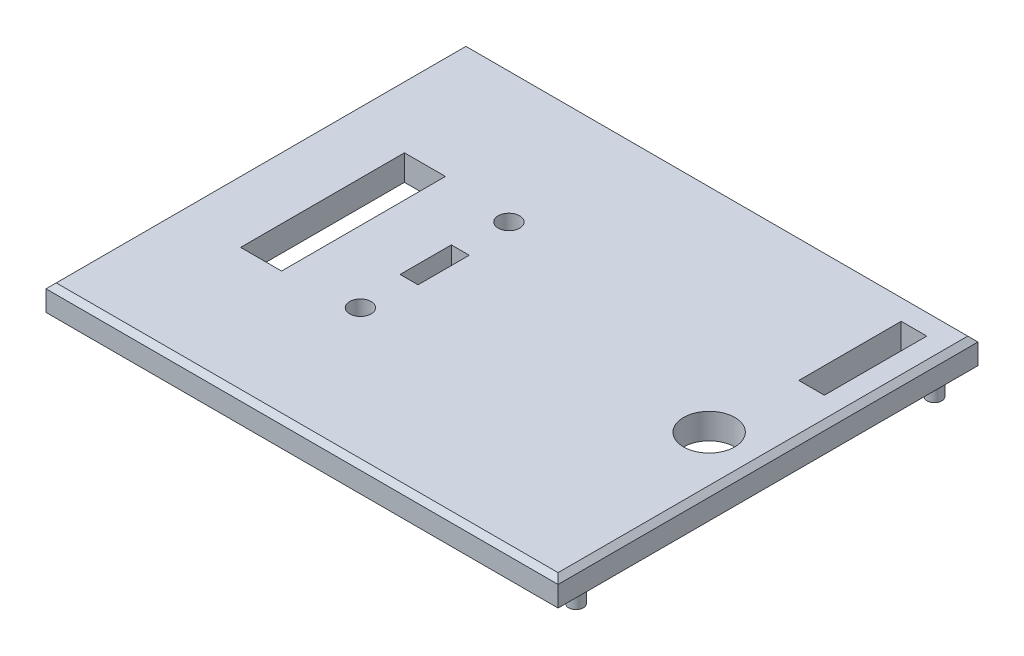
ISO-10303-21;
HEADER;
FILE_DESCRIPTION(('STEP AP214'),'2;1');
FILE_NAME('part.step','',(''),(''),'','','');
FILE_SCHEMA(('AUTOMOTIVE_DESIGN { 1 0 10303 214 1 1 1 1 }'));
ENDSEC;
DATA;
#1=APPLICATION_CONTEXT('core data for automotive mechanical design processes');
#2=APPLICATION_PROTOCOL_DEFINITION('international standard','automotive_design',2000,#1);
#3=PRODUCT_CONTEXT('',#1,'mechanical');
#4=PRODUCT('Part','Part','',(#3));
#5=PRODUCT_RELATED_PRODUCT_CATEGORY('part','',(#4));
#6=PRODUCT_DEFINITION_FORMATION('','',#4);
#7=PRODUCT_DEFINITION_CONTEXT('part definition',#1,'design');
#8=PRODUCT_DEFINITION('design','',#6,#7);
#9=PRODUCT_DEFINITION_SHAPE('','',#8);
#10=(LENGTH_UNIT() NAMED_UNIT(*) SI_UNIT(.MILLI.,.METRE.));
#11=(NAMED_UNIT(*) PLANE_ANGLE_UNIT() SI_UNIT($,.RADIAN.));
#12=(NAMED_UNIT(*) SI_UNIT($,.STERADIAN.) SOLID_ANGLE_UNIT());
#13=UNCERTAINTY_MEASURE_WITH_UNIT(LENGTH_MEASURE(1.E-05),#10,'distance_accuracy_value','');
#14=(GEOMETRIC_REPRESENTATION_CONTEXT(3) GLOBAL_UNCERTAINTY_ASSIGNED_CONTEXT((#13)) GLOBAL_UNIT_ASSIGNED_CONTEXT((#10,
#11,#12)) REPRESENTATION_CONTEXT('',''));
#15=CARTESIAN_POINT('',(0.,0.,0.));
#16=DIRECTION('',(0.,0.,1.));
#17=DIRECTION('',(1.,0.,0.));
#18=AXIS2_PLACEMENT_3D('',#15,#16,#17);
#19=CARTESIAN_POINT('',(0.,5.,5.));
#20=DIRECTION('',(0.,0.,1.));
#21=DIRECTION('',(1.,0.,0.));
#22=AXIS2_PLACEMENT_3D('',#19,#20,#21);
#23=PLANE('',#22);
#24=DIRECTION('',(-1.,0.,0.));
#25=VECTOR('',#24,1.);
#26=CARTESIAN_POINT('',(0.,0.,5.));
#27=LINE('',#26,#25);
#28=CARTESIAN_POINT('',(-13.35,0.,5.));
#29=VERTEX_POINT('',#28);
#30=CARTESIAN_POINT('',(-16.85,0.,5.));
#31=VERTEX_POINT('',#30);
#32=EDGE_CURVE('E304',#29,#31,#27,.T.);
#33=ORIENTED_EDGE('',*,*,#32,.T.);
#34=DIRECTION('',(0.,-1.,0.));
#35=VECTOR('',#34,1.);
#36=CARTESIAN_POINT('',(-16.85,5.,5.));
#37=LINE('',#36,#35);
#38=CARTESIAN_POINT('',(-16.85,5.,5.));
#39=VERTEX_POINT('',#38);
#40=EDGE_CURVE('E331',#39,#31,#37,.T.);
#41=ORIENTED_EDGE('',*,*,#40,.F.);
#42=DIRECTION('',(-1.,0.,0.));
#43=VECTOR('',#42,1.);
#44=CARTESIAN_POINT('',(0.,5.,5.));
#45=LINE('',#44,#43);
#46=CARTESIAN_POINT('',(-13.35,5.,5.));
#47=VERTEX_POINT('',#46);
#48=EDGE_CURVE('E230',#47,#39,#45,.T.);
#49=ORIENTED_EDGE('',*,*,#48,.F.);
#50=DIRECTION('',(0.,-1.,0.));
#51=VECTOR('',#50,1.);
#52=CARTESIAN_POINT('',(-13.35,5.,5.));
#53=LINE('',#52,#51);
#54=EDGE_CURVE('E321',#47,#29,#53,.T.);
#55=ORIENTED_EDGE('',*,*,#54,.T.);
#56=EDGE_LOOP('',(#33,#41,#49,#55));
#57=FACE_BOUND('',#56,.T.);
#58=ADVANCED_FACE('F47',(#57),#23,.F.);
#59=CARTESIAN_POINT('',(-16.85,5.,0.));
#60=DIRECTION('',(-1.,0.,0.));
#61=DIRECTION('',(0.,0.,1.));
#62=AXIS2_PLACEMENT_3D('',#59,#60,#61);
#63=PLANE('',#62);
#64=DIRECTION('',(0.,0.,-1.));
#65=VECTOR('',#64,1.);
#66=CARTESIAN_POINT('',(-16.85,0.,0.));
#67=LINE('',#66,#65);
#68=CARTESIAN_POINT('',(-16.85,0.,-5.));
#69=VERTEX_POINT('',#68);
#70=EDGE_CURVE('E308',#31,#69,#67,.T.);
#71=ORIENTED_EDGE('',*,*,#70,.T.);
#72=DIRECTION('',(0.,-1.,0.));
#73=VECTOR('',#72,1.);
#74=CARTESIAN_POINT('',(-16.85,5.,-5.));
#75=LINE('',#74,#73);
#76=CARTESIAN_POINT('',(-16.85,5.,-5.));
#77=VERTEX_POINT('',#76);
#78=EDGE_CURVE('E328',#77,#69,#75,.T.);
#79=ORIENTED_EDGE('',*,*,#78,.F.);
#80=DIRECTION('',(0.,0.,-1.));
#81=VECTOR('',#80,1.);
#82=CARTESIAN_POINT('',(-16.85,5.,0.));
#83=LINE('',#82,#81);
#84=EDGE_CURVE('E234',#39,#77,#83,.T.);
#85=ORIENTED_EDGE('',*,*,#84,.F.);
#86=ORIENTED_EDGE('',*,*,#40,.T.);
#87=EDGE_LOOP('',(#71,#79,#85,#86));
#88=FACE_BOUND('',#87,.T.);
#89=ADVANCED_FACE('F445',(#88),#63,.F.);
#90=CARTESIAN_POINT('',(0.,5.,-5.));
#91=DIRECTION('',(0.,0.,1.));
#92=DIRECTION('',(1.,0.,0.));
#93=AXIS2_PLACEMENT_3D('',#90,#91,#92);
#94=PLANE('',#93);
#95=DIRECTION('',(-1.,0.,0.));
#96=VECTOR('',#95,1.);
#97=CARTESIAN_POINT('',(0.,0.,-5.));
#98=LINE('',#97,#96);
#99=CARTESIAN_POINT('',(-13.35,0.,-5.));
#100=VERTEX_POINT('',#99);
#101=EDGE_CURVE('E312',#100,#69,#98,.T.);
#102=ORIENTED_EDGE('',*,*,#101,.F.);
#103=DIRECTION('',(0.,-1.,0.));
#104=VECTOR('',#103,1.);
#105=CARTESIAN_POINT('',(-13.35,5.,-5.));
#106=LINE('',#105,#104);
#107=CARTESIAN_POINT('',(-13.35,5.,-5.));
#108=VERTEX_POINT('',#107);
#109=EDGE_CURVE('E324',#108,#100,#106,.T.);
#110=ORIENTED_EDGE('',*,*,#109,.F.);
#111=DIRECTION('',(-1.,0.,0.));
#112=VECTOR('',#111,1.);
#113=CARTESIAN_POINT('',(0.,5.,-5.));
#114=LINE('',#113,#112);
#115=EDGE_CURVE('E237',#108,#77,#114,.T.);
#116=ORIENTED_EDGE('',*,*,#115,.T.);
#117=ORIENTED_EDGE('',*,*,#78,.T.);
#118=EDGE_LOOP('',(#102,#110,#116,#117));
#119=FACE_BOUND('',#118,.T.);
#120=ADVANCED_FACE('F442',(#119),#94,.T.);
#121=CARTESIAN_POINT('',(45.,5.,0.));
#122=DIRECTION('',(-1.,0.,0.));
#123=DIRECTION('',(0.,0.,1.));
#124=AXIS2_PLACEMENT_3D('',#121,#122,#123);
#125=PLANE('',#124);
#126=DIRECTION('',(0.,0.,-1.));
#127=VECTOR('',#126,1.);
#128=CARTESIAN_POINT('',(45.,0.,0.));
#129=LINE('',#128,#127);
#130=CARTESIAN_POINT('',(45.,0.,-16.));
#131=VERTEX_POINT('',#130);
#132=CARTESIAN_POINT('',(45.,0.,-36.));
#133=VERTEX_POINT('',#132);
#134=EDGE_CURVE('E288',#131,#133,#129,.T.);
#135=ORIENTED_EDGE('',*,*,#134,.F.);
#136=DIRECTION('',(0.,-1.,0.));
#137=VECTOR('',#136,1.);
#138=CARTESIAN_POINT('',(45.,5.,-16.));
#139=LINE('',#138,#137);
#140=CARTESIAN_POINT('',(45.,5.,-16.));
#141=VERTEX_POINT('',#140);
#142=EDGE_CURVE('E325',#141,#131,#139,.T.);
#143=ORIENTED_EDGE('',*,*,#142,.F.);
#144=DIRECTION('',(0.,0.,-1.));
#145=VECTOR('',#144,1.);
#146=CARTESIAN_POINT('',(45.,5.,0.));
#147=LINE('',#146,#145);
#148=CARTESIAN_POINT('',(45.,5.,-36.));
#149=VERTEX_POINT('',#148);
#150=EDGE_CURVE('E216',#141,#149,#147,.T.);
#151=ORIENTED_EDGE('',*,*,#150,.T.);
#152=DIRECTION('',(0.,-1.,0.));
#153=VECTOR('',#152,1.);
#154=CARTESIAN_POINT('',(45.,5.,-36.));
#155=LINE('',#154,#153);
#156=EDGE_CURVE('E336',#149,#133,#155,.T.);
#157=ORIENTED_EDGE('',*,*,#156,.T.);
#158=EDGE_LOOP('',(#135,#143,#151,#157));
#159=FACE_BOUND('',#158,.T.);
#160=ADVANCED_FACE('F479',(#159),#125,.T.);
#161=CARTESIAN_POINT('',(0.,5.,-16.));
#162=DIRECTION('',(0.,0.,1.));
#163=DIRECTION('',(1.,0.,0.));
#164=AXIS2_PLACEMENT_3D('',#161,#162,#163);
#165=PLANE('',#164);
#166=DIRECTION('',(-1.,0.,0.));
#167=VECTOR('',#166,1.);
#168=CARTESIAN_POINT('',(0.,0.,-16.));
#169=LINE('',#168,#167);
#170=CARTESIAN_POINT('',(40.,0.,-16.));
#171=VERTEX_POINT('',#170);
#172=EDGE_CURVE('E292',#131,#171,#169,.T.);
#173=ORIENTED_EDGE('',*,*,#172,.T.);
#174=DIRECTION('',(0.,-1.,0.));
#175=VECTOR('',#174,1.);
#176=CARTESIAN_POINT('',(40.,5.,-16.));
#177=LINE('',#176,#175);
#178=CARTESIAN_POINT('',(40.,5.,-16.));
#179=VERTEX_POINT('',#178);
#180=EDGE_CURVE('E343',#179,#171,#177,.T.);
#181=ORIENTED_EDGE('',*,*,#180,.F.);
#182=DIRECTION('',(-1.,0.,0.));
#183=VECTOR('',#182,1.);
#184=CARTESIAN_POINT('',(0.,5.,-16.));
#185=LINE('',#184,#183);
#186=EDGE_CURVE('E220',#141,#179,#185,.T.);
#187=ORIENTED_EDGE('',*,*,#186,.F.);
#188=ORIENTED_EDGE('',*,*,#142,.T.);
#189=EDGE_LOOP('',(#173,#181,#187,#188));
#190=FACE_BOUND('',#189,.T.);
#191=ADVANCED_FACE('F475',(#190),#165,.F.);
#192=CARTESIAN_POINT('',(40.,5.,0.));
#193=DIRECTION('',(1.,0.,0.));
#194=DIRECTION('',(0.,0.,-1.));
#195=AXIS2_PLACEMENT_3D('',#192,#193,#194);
#196=PLANE('',#195);
#197=DIRECTION('',(0.,0.,1.));
#198=VECTOR('',#197,1.);
#199=CARTESIAN_POINT('',(40.,0.,0.));
#200=LINE('',#199,#198);
#201=CARTESIAN_POINT('',(40.,0.,-36.));
#202=VERTEX_POINT('',#201);
#203=EDGE_CURVE('E296',#202,#171,#200,.T.);
#204=ORIENTED_EDGE('',*,*,#203,.F.);
#205=DIRECTION('',(0.,-1.,0.));
#206=VECTOR('',#205,1.);
#207=CARTESIAN_POINT('',(40.,5.,-36.));
#208=LINE('',#207,#206);
#209=CARTESIAN_POINT('',(40.,5.,-36.));
#210=VERTEX_POINT('',#209);
#211=EDGE_CURVE('E339',#210,#202,#208,.T.);
#212=ORIENTED_EDGE('',*,*,#211,.F.);
#213=DIRECTION('',(0.,0.,1.));
#214=VECTOR('',#213,1.);
#215=CARTESIAN_POINT('',(40.,5.,0.));
#216=LINE('',#215,#214);
#217=EDGE_CURVE('E223',#210,#179,#216,.T.);
#218=ORIENTED_EDGE('',*,*,#217,.T.);
#219=ORIENTED_EDGE('',*,*,#180,.T.);
#220=EDGE_LOOP('',(#204,#212,#218,#219));
#221=FACE_BOUND('',#220,.T.);
#222=ADVANCED_FACE('F471',(#221),#196,.T.);
#223=CARTESIAN_POINT('',(50.,5.,0.));
#224=DIRECTION('',(1.,0.,0.));
#225=DIRECTION('',(0.,0.,-1.));
#226=AXIS2_PLACEMENT_3D('',#223,#224,#225);
#227=PLANE('',#226);
#228=DIRECTION('',(0.,-1.,0.));
#229=VECTOR('',#228,1.);
#230=CARTESIAN_POINT('',(50.,5.,-41.));
#231=LINE('',#230,#229);
#232=CARTESIAN_POINT('',(50.,3.99999999999999,-41.));
#233=VERTEX_POINT('',#232);
#234=CARTESIAN_POINT('',(50.,0.,-41.));
#235=VERTEX_POINT('',#234);
#236=EDGE_CURVE('E340',#233,#235,#231,.T.);
#237=ORIENTED_EDGE('',*,*,#236,.F.);
#238=DIRECTION('',(0.,0.,1.));
#239=VECTOR('',#238,1.);
#240=CARTESIAN_POINT('',(50.,3.99999999999999,0.));
#241=LINE('',#240,#239);
#242=CARTESIAN_POINT('',(50.,3.99999999999999,41.));
#243=VERTEX_POINT('',#242);
#244=EDGE_CURVE('E64',#233,#243,#241,.T.);
#245=ORIENTED_EDGE('',*,*,#244,.T.);
#246=DIRECTION('',(0.,-1.,0.));
#247=VECTOR('',#246,1.);
#248=CARTESIAN_POINT('',(50.,5.,41.));
#249=LINE('',#248,#247);
#250=CARTESIAN_POINT('',(50.,0.,41.));
#251=VERTEX_POINT('',#250);
#252=EDGE_CURVE('E186',#243,#251,#249,.T.);
#253=ORIENTED_EDGE('',*,*,#252,.T.);
#254=DIRECTION('',(0.,0.,1.));
#255=VECTOR('',#254,1.);
#256=CARTESIAN_POINT('',(50.,0.,0.));
#257=LINE('',#256,#255);
#258=EDGE_CURVE('E272',#235,#251,#257,.T.);
#259=ORIENTED_EDGE('',*,*,#258,.F.);
#260=EDGE_LOOP('',(#237,#245,#253,#259));
#261=FACE_BOUND('',#260,.T.);
#262=ADVANCED_FACE('F474',(#261),#227,.T.);
#263=CARTESIAN_POINT('',(0.,5.,-41.));
#264=DIRECTION('',(0.,0.,-1.));
#265=DIRECTION('',(-1.,0.,0.));
#266=AXIS2_PLACEMENT_3D('',#263,#264,#265);
#267=PLANE('',#266);
#268=DIRECTION('',(0.,-1.,0.));
#269=VECTOR('',#268,1.);
#270=CARTESIAN_POINT('',(-50.,5.,-41.));
#271=LINE('',#270,#269);
#272=CARTESIAN_POINT('',(-50.,3.99999999999999,-41.));
#273=VERTEX_POINT('',#272);
#274=CARTESIAN_POINT('',(-50.,0.,-41.));
#275=VERTEX_POINT('',#274);
#276=EDGE_CURVE('E353',#273,#275,#271,.T.);
#277=ORIENTED_EDGE('',*,*,#276,.F.);
#278=DIRECTION('',(1.,0.,0.));
#279=VECTOR('',#278,1.);
#280=CARTESIAN_POINT('',(0.,3.99999999999999,-41.));
#281=LINE('',#280,#279);
#282=EDGE_CURVE('E335',#273,#233,#281,.T.);
#283=ORIENTED_EDGE('',*,*,#282,.T.);
#284=ORIENTED_EDGE('',*,*,#236,.T.);
#285=DIRECTION('',(1.,0.,0.));
#286=VECTOR('',#285,1.);
#287=CARTESIAN_POINT('',(0.,0.,-41.));
#288=LINE('',#287,#286);
#289=EDGE_CURVE('E276',#275,#235,#288,.T.);
#290=ORIENTED_EDGE('',*,*,#289,.F.);
#291=EDGE_LOOP('',(#277,#283,#284,#290));
#292=FACE_BOUND('',#291,.T.);
#293=ADVANCED_FACE('F490',(#292),#267,.T.);
#294=CARTESIAN_POINT('',(-50.,5.,0.));
#295=DIRECTION('',(-1.,0.,0.));
#296=DIRECTION('',(0.,0.,1.));
#297=AXIS2_PLACEMENT_3D('',#294,#295,#296);
#298=PLANE('',#297);
#299=DIRECTION('',(0.,-1.,0.));
#300=VECTOR('',#299,1.);
#301=CARTESIAN_POINT('',(-50.,5.,41.));
#302=LINE('',#301,#300);
#303=CARTESIAN_POINT('',(-50.,3.99999999999999,41.));
#304=VERTEX_POINT('',#303);
#305=CARTESIAN_POINT('',(-50.,0.,41.));
#306=VERTEX_POINT('',#305);
#307=EDGE_CURVE('E350',#304,#306,#302,.T.);
#308=ORIENTED_EDGE('',*,*,#307,.F.);
#309=DIRECTION('',(0.,0.,-1.));
#310=VECTOR('',#309,1.);
#311=CARTESIAN_POINT('',(-50.,3.99999999999999,0.));
#312=LINE('',#311,#310);
#313=EDGE_CURVE('E382',#304,#273,#312,.T.);
#314=ORIENTED_EDGE('',*,*,#313,.T.);
#315=ORIENTED_EDGE('',*,*,#276,.T.);
#316=DIRECTION('',(0.,0.,-1.));
#317=VECTOR('',#316,1.);
#318=CARTESIAN_POINT('',(-50.,0.,0.));
#319=LINE('',#318,#317);
#320=EDGE_CURVE('E280',#306,#275,#319,.T.);
#321=ORIENTED_EDGE('',*,*,#320,.F.);
#322=EDGE_LOOP('',(#308,#314,#315,#321));
#323=FACE_BOUND('',#322,.T.);
#324=ADVANCED_FACE('F487',(#323),#298,.T.);
#325=CARTESIAN_POINT('',(0.,5.,16.));
#326=DIRECTION('',(0.,0.,-1.));
#327=DIRECTION('',(-1.,0.,0.));
#328=AXIS2_PLACEMENT_3D('',#325,#326,#327);
#329=PLANE('',#328);
#330=DIRECTION('',(1.,0.,0.));
#331=VECTOR('',#330,1.);
#332=CARTESIAN_POINT('',(0.,0.,16.));
#333=LINE('',#332,#331);
#334=CARTESIAN_POINT('',(-37.,0.,16.));
#335=VERTEX_POINT('',#334);
#336=CARTESIAN_POINT('',(-29.,0.,16.));
#337=VERTEX_POINT('',#336);
#338=EDGE_CURVE('E181',#335,#337,#333,.T.);
#339=ORIENTED_EDGE('',*,*,#338,.F.);
#340=DIRECTION('',(0.,-1.,0.));
#341=VECTOR('',#340,1.);
#342=CARTESIAN_POINT('',(-37.,5.,16.));
#343=LINE('',#342,#341);
#344=CARTESIAN_POINT('',(-37.,5.,16.));
#345=VERTEX_POINT('',#344);
#346=EDGE_CURVE('E175',#345,#335,#343,.T.);
#347=ORIENTED_EDGE('',*,*,#346,.F.);
#348=DIRECTION('',(1.,0.,0.));
#349=VECTOR('',#348,1.);
#350=CARTESIAN_POINT('',(0.,5.,16.));
#351=LINE('',#350,#349);
#352=CARTESIAN_POINT('',(-29.,5.,16.));
#353=VERTEX_POINT('',#352);
#354=EDGE_CURVE('E179',#345,#353,#351,.T.);
#355=ORIENTED_EDGE('',*,*,#354,.T.);
#356=DIRECTION('',(0.,-1.,0.));
#357=VECTOR('',#356,1.);
#358=CARTESIAN_POINT('',(-29.,5.,16.));
#359=LINE('',#358,#357);
#360=EDGE_CURVE('E245',#353,#337,#359,.T.);
#361=ORIENTED_EDGE('',*,*,#360,.T.);
#362=EDGE_LOOP('',(#339,#347,#355,#361));
#363=FACE_BOUND('',#362,.T.);
#364=ADVANCED_FACE('F177',(#363),#329,.T.);
#365=CARTESIAN_POINT('',(-37.,5.,0.));
#366=DIRECTION('',(-1.,0.,0.));
#367=DIRECTION('',(0.,0.,1.));
#368=AXIS2_PLACEMENT_3D('',#365,#366,#367);
#369=PLANE('',#368);
#370=DIRECTION('',(0.,0.,-1.));
#371=VECTOR('',#370,1.);
#372=CARTESIAN_POINT('',(-37.,0.,0.));
#373=LINE('',#372,#371);
#374=CARTESIAN_POINT('',(-37.,0.,-16.));
#375=VERTEX_POINT('',#374);
#376=EDGE_CURVE('E261',#335,#375,#373,.T.);
#377=ORIENTED_EDGE('',*,*,#376,.T.);
#378=DIRECTION('',(0.,-1.,0.));
#379=VECTOR('',#378,1.);
#380=CARTESIAN_POINT('',(-37.,5.,-16.));
#381=LINE('',#380,#379);
#382=CARTESIAN_POINT('',(-37.,5.,-16.));
#383=VERTEX_POINT('',#382);
#384=EDGE_CURVE('E187',#383,#375,#381,.T.);
#385=ORIENTED_EDGE('',*,*,#384,.F.);
#386=DIRECTION('',(0.,0.,-1.));
#387=VECTOR('',#386,1.);
#388=CARTESIAN_POINT('',(-37.,5.,0.));
#389=LINE('',#388,#387);
#390=EDGE_CURVE('E191',#345,#383,#389,.T.);
#391=ORIENTED_EDGE('',*,*,#390,.F.);
#392=ORIENTED_EDGE('',*,*,#346,.T.);
#393=EDGE_LOOP('',(#377,#385,#391,#392));
#394=FACE_BOUND('',#393,.T.);
#395=ADVANCED_FACE('F192',(#394),#369,.F.);
#396=CARTESIAN_POINT('',(0.,5.,-16.));
#397=DIRECTION('',(0.,0.,-1.));
#398=DIRECTION('',(-1.,0.,0.));
#399=AXIS2_PLACEMENT_3D('',#396,#397,#398);
#400=PLANE('',#399);
#401=DIRECTION('',(1.,0.,0.));
#402=VECTOR('',#401,1.);
#403=CARTESIAN_POINT('',(0.,0.,-16.));
#404=LINE('',#403,#402);
#405=CARTESIAN_POINT('',(-29.,0.,-16.));
#406=VERTEX_POINT('',#405);
#407=EDGE_CURVE('E264',#375,#406,#404,.T.);
#408=ORIENTED_EDGE('',*,*,#407,.T.);
#409=DIRECTION('',(0.,-1.,0.));
#410=VECTOR('',#409,1.);
#411=CARTESIAN_POINT('',(-29.,5.,-16.));
#412=LINE('',#411,#410);
#413=CARTESIAN_POINT('',(-29.,5.,-16.));
#414=VERTEX_POINT('',#413);
#415=EDGE_CURVE('E360',#414,#406,#412,.T.);
#416=ORIENTED_EDGE('',*,*,#415,.F.);
#417=DIRECTION('',(1.,0.,0.));
#418=VECTOR('',#417,1.);
#419=CARTESIAN_POINT('',(0.,5.,-16.));
#420=LINE('',#419,#418);
#421=EDGE_CURVE('E197',#383,#414,#420,.T.);
#422=ORIENTED_EDGE('',*,*,#421,.F.);
#423=ORIENTED_EDGE('',*,*,#384,.T.);
#424=EDGE_LOOP('',(#408,#416,#422,#423));
#425=FACE_BOUND('',#424,.T.);
#426=ADVANCED_FACE('F469',(#425),#400,.F.);
#427=CARTESIAN_POINT('',(0.,5.,-36.));
#428=DIRECTION('',(0.,0.,-1.));
#429=DIRECTION('',(-1.,0.,0.));
#430=AXIS2_PLACEMENT_3D('',#427,#428,#429);
#431=PLANE('',#430);
#432=DIRECTION('',(1.,0.,0.));
#433=VECTOR('',#432,1.);
#434=CARTESIAN_POINT('',(0.,0.,-36.));
#435=LINE('',#434,#433);
#436=EDGE_CURVE('E300',#202,#133,#435,.T.);
#437=ORIENTED_EDGE('',*,*,#436,.T.);
#438=ORIENTED_EDGE('',*,*,#156,.F.);
#439=DIRECTION('',(1.,0.,0.));
#440=VECTOR('',#439,1.);
#441=CARTESIAN_POINT('',(0.,5.,-36.));
#442=LINE('',#441,#440);
#443=EDGE_CURVE('E227',#210,#149,#442,.T.);
#444=ORIENTED_EDGE('',*,*,#443,.F.);
#445=ORIENTED_EDGE('',*,*,#211,.T.);
#446=EDGE_LOOP('',(#437,#438,#444,#445));
#447=FACE_BOUND('',#446,.T.);
#448=ADVANCED_FACE('F465',(#447),#431,.F.);
#449=CARTESIAN_POINT('',(0.,5.,41.));
#450=DIRECTION('',(0.,0.,-1.));
#451=DIRECTION('',(-1.,0.,0.));
#452=AXIS2_PLACEMENT_3D('',#449,#450,#451);
#453=PLANE('',#452);
#454=ORIENTED_EDGE('',*,*,#252,.F.);
#455=DIRECTION('',(-1.,0.,0.));
#456=VECTOR('',#455,1.);
#457=CARTESIAN_POINT('',(-50.,3.99999999999999,41.));
#458=LINE('',#457,#456);
#459=EDGE_CURVE('E71',#243,#304,#458,.T.);
#460=ORIENTED_EDGE('',*,*,#459,.T.);
#461=ORIENTED_EDGE('',*,*,#307,.T.);
#462=DIRECTION('',(1.,0.,0.));
#463=VECTOR('',#462,1.);
#464=CARTESIAN_POINT('',(0.,0.,41.));
#465=LINE('',#464,#463);
#466=EDGE_CURVE('E284',#306,#251,#465,.T.);
#467=ORIENTED_EDGE('',*,*,#466,.T.);
#468=EDGE_LOOP('',(#454,#460,#461,#467));
#469=FACE_BOUND('',#468,.T.);
#470=ADVANCED_FACE('F468',(#469),#453,.F.);
#471=CARTESIAN_POINT('',(-29.,5.,0.));
#472=DIRECTION('',(1.,0.,0.));
#473=DIRECTION('',(0.,0.,-1.));
#474=AXIS2_PLACEMENT_3D('',#471,#472,#473);
#475=PLANE('',#474);
#476=DIRECTION('',(0.,0.,1.));
#477=VECTOR('',#476,1.);
#478=CARTESIAN_POINT('',(-29.,0.,0.));
#479=LINE('',#478,#477);
#480=EDGE_CURVE('E268',#406,#337,#479,.T.);
#481=ORIENTED_EDGE('',*,*,#480,.T.);
#482=ORIENTED_EDGE('',*,*,#360,.F.);
#483=DIRECTION('',(0.,0.,1.));
#484=VECTOR('',#483,1.);
#485=CARTESIAN_POINT('',(-29.,5.,0.));
#486=LINE('',#485,#484);
#487=EDGE_CURVE('E201',#414,#353,#486,.T.);
#488=ORIENTED_EDGE('',*,*,#487,.F.);
#489=ORIENTED_EDGE('',*,*,#415,.T.);
#490=EDGE_LOOP('',(#481,#482,#488,#489));
#491=FACE_BOUND('',#490,.T.);
#492=ADVANCED_FACE('F486',(#491),#475,.F.);
#493=CARTESIAN_POINT('',(40.,5.,1.50000000000001));
#494=DIRECTION('',(0.,-1.,0.));
#495=DIRECTION('',(0.,0.,-1.));
#496=AXIS2_PLACEMENT_3D('',#493,#494,#495);
#497=CYLINDRICAL_SURFACE('',#496,5.);
#498=CARTESIAN_POINT('',(40.,5.,1.50000000000001));
#499=DIRECTION('',(0.,1.,0.));
#500=DIRECTION('',(0.,0.,1.));
#501=AXIS2_PLACEMENT_3D('',#498,#499,#500);
#502=CIRCLE('',#501,5.);
#503=CARTESIAN_POINT('',(40.,5.,6.50000000000001));
#504=VERTEX_POINT('',#503);
#505=EDGE_CURVE('E204',#504,#504,#502,.T.);
#506=ORIENTED_EDGE('',*,*,#505,.T.);
#507=EDGE_LOOP('',(#506));
#508=FACE_BOUND('',#507,.T.);
#509=CARTESIAN_POINT('',(40.,0.,1.50000000000001));
#510=DIRECTION('',(0.,1.,0.));
#511=DIRECTION('',(0.,0.,1.));
#512=AXIS2_PLACEMENT_3D('',#509,#510,#511);
#513=CIRCLE('',#512,5.);
#514=CARTESIAN_POINT('',(40.,0.,6.50000000000001));
#515=VERTEX_POINT('',#514);
#516=EDGE_CURVE('E255',#515,#515,#513,.T.);
#517=ORIENTED_EDGE('',*,*,#516,.F.);
#518=EDGE_LOOP('',(#517));
#519=FACE_BOUND('',#518,.T.);
#520=ADVANCED_FACE('F499',(#508,#519),#497,.F.);
#521=CARTESIAN_POINT('',(-15.1,5.,-14.5));
#522=DIRECTION('',(0.,-1.,0.));
#523=DIRECTION('',(0.,0.,-1.));
#524=AXIS2_PLACEMENT_3D('',#521,#522,#523);
#525=CYLINDRICAL_SURFACE('',#524,2.1);
#526=CARTESIAN_POINT('',(-15.1,5.,-14.5));
#527=DIRECTION('',(0.,1.,0.));
#528=DIRECTION('',(0.,0.,1.));
#529=AXIS2_PLACEMENT_3D('',#526,#527,#528);
#530=CIRCLE('',#529,2.1);
#531=CARTESIAN_POINT('',(-15.1,5.,-12.4));
#532=VERTEX_POINT('',#531);
#533=EDGE_CURVE('E208',#532,#532,#530,.T.);
#534=ORIENTED_EDGE('',*,*,#533,.T.);
#535=EDGE_LOOP('',(#534));
#536=FACE_BOUND('',#535,.T.);
#537=CARTESIAN_POINT('',(-15.1,0.,-14.5));
#538=DIRECTION('',(0.,1.,0.));
#539=DIRECTION('',(0.,0.,1.));
#540=AXIS2_PLACEMENT_3D('',#537,#538,#539);
#541=CIRCLE('',#540,2.1);
#542=CARTESIAN_POINT('',(-15.1,0.,-12.4));
#543=VERTEX_POINT('',#542);
#544=EDGE_CURVE('E250',#543,#543,#541,.T.);
#545=ORIENTED_EDGE('',*,*,#544,.F.);
#546=EDGE_LOOP('',(#545));
#547=FACE_BOUND('',#546,.T.);
#548=ADVANCED_FACE('F510',(#536,#547),#525,.F.);
#549=CARTESIAN_POINT('',(-15.1,5.,14.5));
#550=DIRECTION('',(0.,-1.,0.));
#551=DIRECTION('',(0.,0.,-1.));
#552=AXIS2_PLACEMENT_3D('',#549,#550,#551);
#553=CYLINDRICAL_SURFACE('',#552,2.1);
#554=CARTESIAN_POINT('',(-15.1,5.,14.5));
#555=DIRECTION('',(0.,1.,0.));
#556=DIRECTION('',(0.,0.,1.));
#557=AXIS2_PLACEMENT_3D('',#554,#555,#556);
#558=CIRCLE('',#557,2.1);
#559=CARTESIAN_POINT('',(-15.1,5.,16.6));
#560=VERTEX_POINT('',#559);
#561=EDGE_CURVE('E320',#560,#560,#558,.T.);
#562=ORIENTED_EDGE('',*,*,#561,.T.);
#563=EDGE_LOOP('',(#562));
#564=FACE_BOUND('',#563,.T.);
#565=CARTESIAN_POINT('',(-15.1,0.,14.5));
#566=DIRECTION('',(0.,1.,0.));
#567=DIRECTION('',(0.,0.,1.));
#568=AXIS2_PLACEMENT_3D('',#565,#566,#567);
#569=CIRCLE('',#568,2.1);
#570=CARTESIAN_POINT('',(-15.1,0.,16.6));
#571=VERTEX_POINT('',#570);
#572=EDGE_CURVE('E246',#571,#571,#569,.T.);
#573=ORIENTED_EDGE('',*,*,#572,.F.);
#574=EDGE_LOOP('',(#573));
#575=FACE_BOUND('',#574,.T.);
#576=ADVANCED_FACE('F453',(#564,#575),#553,.F.);
#577=CARTESIAN_POINT('',(-13.35,5.,0.));
#578=DIRECTION('',(-1.,0.,0.));
#579=DIRECTION('',(0.,0.,1.));
#580=AXIS2_PLACEMENT_3D('',#577,#578,#579);
#581=PLANE('',#580);
#582=DIRECTION('',(0.,0.,-1.));
#583=VECTOR('',#582,1.);
#584=CARTESIAN_POINT('',(-13.35,0.,0.));
#585=LINE('',#584,#583);
#586=EDGE_CURVE('E316',#29,#100,#585,.T.);
#587=ORIENTED_EDGE('',*,*,#586,.F.);
#588=ORIENTED_EDGE('',*,*,#54,.F.);
#589=DIRECTION('',(0.,0.,-1.));
#590=VECTOR('',#589,1.);
#591=CARTESIAN_POINT('',(-13.35,5.,0.));
#592=LINE('',#591,#590);
#593=EDGE_CURVE('E241',#47,#108,#592,.T.);
#594=ORIENTED_EDGE('',*,*,#593,.T.);
#595=ORIENTED_EDGE('',*,*,#109,.T.);
#596=EDGE_LOOP('',(#587,#588,#594,#595));
#597=FACE_BOUND('',#596,.T.);
#598=ADVANCED_FACE('F436',(#597),#581,.T.);
#599=CARTESIAN_POINT('',(0.,5.,0.));
#600=DIRECTION('',(0.,1.,0.));
#601=DIRECTION('',(0.,0.,1.));
#602=AXIS2_PLACEMENT_3D('',#599,#600,#601);
#603=PLANE('',#602);
#604=DIRECTION('',(0.,0.,-1.));
#605=VECTOR('',#604,1.);
#606=CARTESIAN_POINT('',(49.,5.,0.));
#607=LINE('',#606,#605);
#608=CARTESIAN_POINT('',(49.,5.,40.));
#609=VERTEX_POINT('',#608);
#610=CARTESIAN_POINT('',(49.,5.,-40.));
#611=VERTEX_POINT('',#610);
#612=EDGE_CURVE('E369',#609,#611,#607,.T.);
#613=ORIENTED_EDGE('',*,*,#612,.T.);
#614=DIRECTION('',(-1.,0.,0.));
#615=VECTOR('',#614,1.);
#616=CARTESIAN_POINT('',(0.,5.,-40.));
#617=LINE('',#616,#615);
#618=CARTESIAN_POINT('',(-49.,5.,-40.));
#619=VERTEX_POINT('',#618);
#620=EDGE_CURVE('E378',#611,#619,#617,.T.);
#621=ORIENTED_EDGE('',*,*,#620,.T.);
#622=DIRECTION('',(0.,0.,1.));
#623=VECTOR('',#622,1.);
#624=CARTESIAN_POINT('',(-49.,5.,0.));
#625=LINE('',#624,#623);
#626=CARTESIAN_POINT('',(-49.,5.,40.));
#627=VERTEX_POINT('',#626);
#628=EDGE_CURVE('E375',#619,#627,#625,.T.);
#629=ORIENTED_EDGE('',*,*,#628,.T.);
#630=DIRECTION('',(1.,0.,0.));
#631=VECTOR('',#630,1.);
#632=CARTESIAN_POINT('',(50.,5.,40.));
#633=LINE('',#632,#631);
#634=EDGE_CURVE('E372',#627,#609,#633,.T.);
#635=ORIENTED_EDGE('',*,*,#634,.T.);
#636=EDGE_LOOP('',(#613,#621,#629,#635));
#637=FACE_BOUND('',#636,.T.);
#638=ORIENTED_EDGE('',*,*,#561,.F.);
#639=EDGE_LOOP('',(#638));
#640=FACE_BOUND('',#639,.T.);
#641=ORIENTED_EDGE('',*,*,#533,.F.);
#642=EDGE_LOOP('',(#641));
#643=FACE_BOUND('',#642,.T.);
#644=ORIENTED_EDGE('',*,*,#505,.F.);
#645=EDGE_LOOP('',(#644));
#646=FACE_BOUND('',#645,.T.);
#647=ORIENTED_EDGE('',*,*,#354,.F.);
#648=ORIENTED_EDGE('',*,*,#390,.T.);
#649=ORIENTED_EDGE('',*,*,#421,.T.);
#650=ORIENTED_EDGE('',*,*,#487,.T.);
#651=EDGE_LOOP('',(#647,#648,#649,#650));
#652=FACE_BOUND('',#651,.T.);
#653=ORIENTED_EDGE('',*,*,#150,.F.);
#654=ORIENTED_EDGE('',*,*,#186,.T.);
#655=ORIENTED_EDGE('',*,*,#217,.F.);
#656=ORIENTED_EDGE('',*,*,#443,.T.);
#657=EDGE_LOOP('',(#653,#654,#655,#656));
#658=FACE_BOUND('',#657,.T.);
#659=ORIENTED_EDGE('',*,*,#48,.T.);
#660=ORIENTED_EDGE('',*,*,#84,.T.);
#661=ORIENTED_EDGE('',*,*,#115,.F.);
#662=ORIENTED_EDGE('',*,*,#593,.F.);
#663=EDGE_LOOP('',(#659,#660,#661,#662));
#664=FACE_BOUND('',#663,.T.);
#665=ADVANCED_FACE('F199',(#637,#640,#643,#646,#652,#658,#664),#603,.T.);
#666=CARTESIAN_POINT('',(0.,0.,0.));
#667=DIRECTION('',(0.,1.,0.));
#668=DIRECTION('',(0.,0.,1.));
#669=AXIS2_PLACEMENT_3D('',#666,#667,#668);
#670=PLANE('',#669);
#671=CARTESIAN_POINT('',(-47.5,0.,-35.));
#672=DIRECTION('',(0.,1.,0.));
#673=DIRECTION('',(0.,0.,1.));
#674=AXIS2_PLACEMENT_3D('',#671,#672,#673);
#675=CIRCLE('',#674,1.435);
#676=CARTESIAN_POINT('',(-47.5,0.,-33.565));
#677=VERTEX_POINT('',#676);
#678=EDGE_CURVE('E11',#677,#677,#675,.F.);
#679=ORIENTED_EDGE('',*,*,#678,.F.);
#680=EDGE_LOOP('',(#679));
#681=FACE_BOUND('',#680,.T.);
#682=CARTESIAN_POINT('',(47.5,0.,-35.));
#683=DIRECTION('',(0.,-1.,0.));
#684=DIRECTION('',(0.,0.,-1.));
#685=AXIS2_PLACEMENT_3D('',#682,#683,#684);
#686=CIRCLE('',#685,1.435);
#687=CARTESIAN_POINT('',(47.5,0.,-36.435));
#688=VERTEX_POINT('',#687);
#689=EDGE_CURVE('E853',#688,#688,#686,.F.);
#690=ORIENTED_EDGE('',*,*,#689,.T.);
#691=EDGE_LOOP('',(#690));
#692=FACE_BOUND('',#691,.T.);
#693=CARTESIAN_POINT('',(47.5,0.,35.));
#694=DIRECTION('',(0.,1.,0.));
#695=DIRECTION('',(0.,0.,1.));
#696=AXIS2_PLACEMENT_3D('',#693,#694,#695);
#697=CIRCLE('',#696,1.435);
#698=CARTESIAN_POINT('',(47.5,0.,36.435));
#699=VERTEX_POINT('',#698);
#700=EDGE_CURVE('E57',#699,#699,#697,.F.);
#701=ORIENTED_EDGE('',*,*,#700,.F.);
#702=EDGE_LOOP('',(#701));
#703=FACE_BOUND('',#702,.T.);
#704=CARTESIAN_POINT('',(-47.5,0.,35.));
#705=DIRECTION('',(0.,-1.,0.));
#706=DIRECTION('',(0.,0.,-1.));
#707=AXIS2_PLACEMENT_3D('',#704,#705,#706);
#708=CIRCLE('',#707,1.435);
#709=CARTESIAN_POINT('',(-47.5,0.,33.565));
#710=VERTEX_POINT('',#709);
#711=EDGE_CURVE('E416',#710,#710,#708,.F.);
#712=ORIENTED_EDGE('',*,*,#711,.T.);
#713=EDGE_LOOP('',(#712));
#714=FACE_BOUND('',#713,.T.);
#715=ORIENTED_EDGE('',*,*,#572,.T.);
#716=EDGE_LOOP('',(#715));
#717=FACE_BOUND('',#716,.T.);
#718=ORIENTED_EDGE('',*,*,#544,.T.);
#719=EDGE_LOOP('',(#718));
#720=FACE_BOUND('',#719,.T.);
#721=ORIENTED_EDGE('',*,*,#516,.T.);
#722=EDGE_LOOP('',(#721));
#723=FACE_BOUND('',#722,.T.);
#724=ORIENTED_EDGE('',*,*,#338,.T.);
#725=ORIENTED_EDGE('',*,*,#480,.F.);
#726=ORIENTED_EDGE('',*,*,#407,.F.);
#727=ORIENTED_EDGE('',*,*,#376,.F.);
#728=EDGE_LOOP('',(#724,#725,#726,#727));
#729=FACE_BOUND('',#728,.T.);
#730=ORIENTED_EDGE('',*,*,#258,.T.);
#731=ORIENTED_EDGE('',*,*,#466,.F.);
#732=ORIENTED_EDGE('',*,*,#320,.T.);
#733=ORIENTED_EDGE('',*,*,#289,.T.);
#734=EDGE_LOOP('',(#730,#731,#732,#733));
#735=FACE_BOUND('',#734,.T.);
#736=ORIENTED_EDGE('',*,*,#134,.T.);
#737=ORIENTED_EDGE('',*,*,#436,.F.);
#738=ORIENTED_EDGE('',*,*,#203,.T.);
#739=ORIENTED_EDGE('',*,*,#172,.F.);
#740=EDGE_LOOP('',(#736,#737,#738,#739));
#741=FACE_BOUND('',#740,.T.);
#742=ORIENTED_EDGE('',*,*,#32,.F.);
#743=ORIENTED_EDGE('',*,*,#586,.T.);
#744=ORIENTED_EDGE('',*,*,#101,.T.);
#745=ORIENTED_EDGE('',*,*,#70,.F.);
#746=EDGE_LOOP('',(#742,#743,#744,#745));
#747=FACE_BOUND('',#746,.T.);
#748=ADVANCED_FACE('F408',(#681,#692,#703,#714,#717,#720,#723,#729,#735,#741,#747),#670,.F.);
#749=CARTESIAN_POINT('',(0.,5.,40.));
#750=DIRECTION('',(0.,0.707106781186547,0.707106781186547));
#751=DIRECTION('',(-1.,0.,0.));
#752=AXIS2_PLACEMENT_3D('',#749,#750,#751);
#753=PLANE('',#752);
#754=DIRECTION('',(-0.577350269189626,0.577350269189626,-0.577350269189626));
#755=VECTOR('',#754,1.);
#756=CARTESIAN_POINT('',(36.3333333333334,17.6666666666667,27.3333333333333));
#757=LINE('',#756,#755);
#758=EDGE_CURVE('E396',#609,#243,#757,.F.);
#759=ORIENTED_EDGE('',*,*,#758,.F.);
#760=ORIENTED_EDGE('',*,*,#634,.F.);
#761=DIRECTION('',(0.577350269189626,0.577350269189626,-0.577350269189626));
#762=VECTOR('',#761,1.);
#763=CARTESIAN_POINT('',(-32.6666666666667,21.3333333333333,23.6666666666667));
#764=LINE('',#763,#762);
#765=EDGE_CURVE('E251',#304,#627,#764,.T.);
#766=ORIENTED_EDGE('',*,*,#765,.F.);
#767=ORIENTED_EDGE('',*,*,#459,.F.);
#768=EDGE_LOOP('',(#759,#760,#766,#767));
#769=FACE_BOUND('',#768,.T.);
#770=ADVANCED_FACE('F50',(#769),#753,.T.);
#771=CARTESIAN_POINT('',(-50.,3.99999999999999,0.));
#772=DIRECTION('',(0.707106781186547,-0.707106781186547,0.));
#773=DIRECTION('',(0.,0.,-1.));
#774=AXIS2_PLACEMENT_3D('',#771,#772,#773);
#775=PLANE('',#774);
#776=ORIENTED_EDGE('',*,*,#765,.T.);
#777=ORIENTED_EDGE('',*,*,#628,.F.);
#778=DIRECTION('',(-0.577350269189626,-0.577350269189626,-0.577350269189626));
#779=VECTOR('',#778,1.);
#780=CARTESIAN_POINT('',(-36.3333333333333,17.6666666666666,-27.3333333333333));
#781=LINE('',#780,#779);
#782=EDGE_CURVE('E392',#273,#619,#781,.F.);
#783=ORIENTED_EDGE('',*,*,#782,.F.);
#784=ORIENTED_EDGE('',*,*,#313,.F.);
#785=EDGE_LOOP('',(#776,#777,#783,#784));
#786=FACE_BOUND('',#785,.T.);
#787=ADVANCED_FACE('F532',(#786),#775,.F.);
#788=CARTESIAN_POINT('',(50.,3.99999999999999,0.));
#789=DIRECTION('',(-0.707106781186547,-0.707106781186547,0.));
#790=DIRECTION('',(0.,0.,1.));
#791=AXIS2_PLACEMENT_3D('',#788,#789,#790);
#792=PLANE('',#791);
#793=ORIENTED_EDGE('',*,*,#758,.T.);
#794=ORIENTED_EDGE('',*,*,#244,.F.);
#795=DIRECTION('',(-0.577350269189626,0.577350269189626,0.577350269189626));
#796=VECTOR('',#795,1.);
#797=CARTESIAN_POINT('',(36.3333333333334,17.6666666666666,-27.3333333333333));
#798=LINE('',#797,#796);
#799=EDGE_CURVE('E389',#611,#233,#798,.F.);
#800=ORIENTED_EDGE('',*,*,#799,.F.);
#801=ORIENTED_EDGE('',*,*,#612,.F.);
#802=EDGE_LOOP('',(#793,#794,#800,#801));
#803=FACE_BOUND('',#802,.T.);
#804=ADVANCED_FACE('F526',(#803),#792,.F.);
#805=CARTESIAN_POINT('',(0.,3.99999999999999,-41.));
#806=DIRECTION('',(0.,-0.707106781186547,0.707106781186547));
#807=DIRECTION('',(1.,0.,0.));
#808=AXIS2_PLACEMENT_3D('',#805,#806,#807);
#809=PLANE('',#808);
#810=ORIENTED_EDGE('',*,*,#782,.T.);
#811=ORIENTED_EDGE('',*,*,#620,.F.);
#812=ORIENTED_EDGE('',*,*,#799,.T.);
#813=ORIENTED_EDGE('',*,*,#282,.F.);
#814=EDGE_LOOP('',(#810,#811,#812,#813));
#815=FACE_BOUND('',#814,.T.);
#816=ADVANCED_FACE('F519',(#815),#809,.F.);
#817=CARTESIAN_POINT('',(-47.5,-3.5,35.));
#818=DIRECTION('',(0.,1.,0.));
#819=DIRECTION('',(0.,0.,1.));
#820=AXIS2_PLACEMENT_3D('',#817,#818,#819);
#821=CYLINDRICAL_SURFACE('',#820,1.435);
#822=CARTESIAN_POINT('',(-47.5,-3.5,35.));
#823=DIRECTION('',(0.,-1.,0.));
#824=DIRECTION('',(0.,0.,-1.));
#825=AXIS2_PLACEMENT_3D('',#822,#823,#824);
#826=CIRCLE('',#825,1.435);
#827=CARTESIAN_POINT('',(-47.5,-3.5,33.565));
#828=VERTEX_POINT('',#827);
#829=EDGE_CURVE('E393',#828,#828,#826,.F.);
#830=ORIENTED_EDGE('',*,*,#829,.T.);
#831=EDGE_LOOP('',(#830));
#832=FACE_BOUND('',#831,.T.);
#833=ORIENTED_EDGE('',*,*,#711,.F.);
#834=EDGE_LOOP('',(#833));
#835=FACE_BOUND('',#834,.T.);
#836=ADVANCED_FACE('F525',(#832,#835),#821,.T.);
#837=CARTESIAN_POINT('',(0.,-3.5,0.));
#838=DIRECTION('',(0.,-1.,0.));
#839=DIRECTION('',(0.,0.,-1.));
#840=AXIS2_PLACEMENT_3D('',#837,#838,#839);
#841=PLANE('',#840);
#842=ORIENTED_EDGE('',*,*,#829,.F.);
#843=EDGE_LOOP('',(#842));
#844=FACE_BOUND('',#843,.T.);
#845=ADVANCED_FACE('F576',(#844),#841,.T.);
#846=CARTESIAN_POINT('',(47.5,-3.5,35.));
#847=DIRECTION('',(0.,1.,0.));
#848=DIRECTION('',(0.,0.,1.));
#849=AXIS2_PLACEMENT_3D('',#846,#847,#848);
#850=CYLINDRICAL_SURFACE('',#849,1.435);
#851=CARTESIAN_POINT('',(47.5,-3.5,35.));
#852=DIRECTION('',(0.,-1.,0.));
#853=DIRECTION('',(0.,0.,-1.));
#854=AXIS2_PLACEMENT_3D('',#851,#852,#853);
#855=CIRCLE('',#854,1.435);
#856=CARTESIAN_POINT('',(47.5,-3.5,33.565));
#857=VERTEX_POINT('',#856);
#858=EDGE_CURVE('E862',#857,#857,#855,.T.);
#859=ORIENTED_EDGE('',*,*,#858,.F.);
#860=EDGE_LOOP('',(#859));
#861=FACE_BOUND('',#860,.T.);
#862=ORIENTED_EDGE('',*,*,#700,.T.);
#863=EDGE_LOOP('',(#862));
#864=FACE_BOUND('',#863,.T.);
#865=ADVANCED_FACE('F406',(#861,#864),#850,.T.);
#866=CARTESIAN_POINT('',(0.,-3.5,0.));
#867=DIRECTION('',(0.,-1.,0.));
#868=DIRECTION('',(0.,0.,-1.));
#869=AXIS2_PLACEMENT_3D('',#866,#867,#868);
#870=PLANE('',#869);
#871=ORIENTED_EDGE('',*,*,#858,.T.);
#872=EDGE_LOOP('',(#871));
#873=FACE_BOUND('',#872,.T.);
#874=ADVANCED_FACE('F596',(#873),#870,.T.);
#875=CARTESIAN_POINT('',(47.5,-3.5,-35.));
#876=DIRECTION('',(0.,1.,0.));
#877=DIRECTION('',(0.,0.,1.));
#878=AXIS2_PLACEMENT_3D('',#875,#876,#877);
#879=CYLINDRICAL_SURFACE('',#878,1.435);
#880=CARTESIAN_POINT('',(47.5,-3.5,-35.));
#881=DIRECTION('',(0.,-1.,0.));
#882=DIRECTION('',(0.,0.,-1.));
#883=AXIS2_PLACEMENT_3D('',#880,#881,#882);
#884=CIRCLE('',#883,1.435);
#885=CARTESIAN_POINT('',(47.5,-3.5,-36.435));
#886=VERTEX_POINT('',#885);
#887=EDGE_CURVE('E857',#886,#886,#884,.F.);
#888=ORIENTED_EDGE('',*,*,#887,.T.);
#889=EDGE_LOOP('',(#888));
#890=FACE_BOUND('',#889,.T.);
#891=ORIENTED_EDGE('',*,*,#689,.F.);
#892=EDGE_LOOP('',(#891));
#893=FACE_BOUND('',#892,.T.);
#894=ADVANCED_FACE('F607',(#890,#893),#879,.T.);
#895=CARTESIAN_POINT('',(0.,-3.5,0.));
#896=DIRECTION('',(0.,-1.,0.));
#897=DIRECTION('',(0.,0.,-1.));
#898=AXIS2_PLACEMENT_3D('',#895,#896,#897);
#899=PLANE('',#898);
#900=ORIENTED_EDGE('',*,*,#887,.F.);
#901=EDGE_LOOP('',(#900));
#902=FACE_BOUND('',#901,.T.);
#903=ADVANCED_FACE('F618',(#902),#899,.T.);
#904=CARTESIAN_POINT('',(-47.5,-3.5,-35.));
#905=DIRECTION('',(0.,1.,0.));
#906=DIRECTION('',(0.,0.,1.));
#907=AXIS2_PLACEMENT_3D('',#904,#905,#906);
#908=CYLINDRICAL_SURFACE('',#907,1.435);
#909=CARTESIAN_POINT('',(-47.5,-3.5,-35.));
#910=DIRECTION('',(0.,-1.,0.));
#911=DIRECTION('',(0.,0.,-1.));
#912=AXIS2_PLACEMENT_3D('',#909,#910,#911);
#913=CIRCLE('',#912,1.435);
#914=CARTESIAN_POINT('',(-47.5,-3.5,-36.435));
#915=VERTEX_POINT('',#914);
#916=EDGE_CURVE('E851',#915,#915,#913,.T.);
#917=ORIENTED_EDGE('',*,*,#916,.F.);
#918=EDGE_LOOP('',(#917));
#919=FACE_BOUND('',#918,.T.);
#920=ORIENTED_EDGE('',*,*,#678,.T.);
#921=EDGE_LOOP('',(#920));
#922=FACE_BOUND('',#921,.T.);
#923=ADVANCED_FACE('F629',(#919,#922),#908,.T.);
#924=CARTESIAN_POINT('',(0.,-3.5,0.));
#925=DIRECTION('',(0.,-1.,0.));
#926=DIRECTION('',(0.,0.,-1.));
#927=AXIS2_PLACEMENT_3D('',#924,#925,#926);
#928=PLANE('',#927);
#929=ORIENTED_EDGE('',*,*,#916,.T.);
#930=EDGE_LOOP('',(#929));
#931=FACE_BOUND('',#930,.T.);
#932=ADVANCED_FACE('F640',(#931),#928,.T.);
#933=CLOSED_SHELL('',(#58,#89,#120,#160,#191,#222,#262,#293,#324,#364,#395,#426,#448,#470,#492,
#520,#548,#576,#598,#665,#748,#770,#787,#804,#816,#836,#845,#865,#874,#894,#903,#923,#932));
#934=MANIFOLD_SOLID_BREP('B2',#933);
#935=ADVANCED_BREP_SHAPE_REPRESENTATION('',(#18,#934),#14);
#936=SHAPE_DEFINITION_REPRESENTATION(#9,#935);
ENDSEC;
END-ISO-10303-21;
